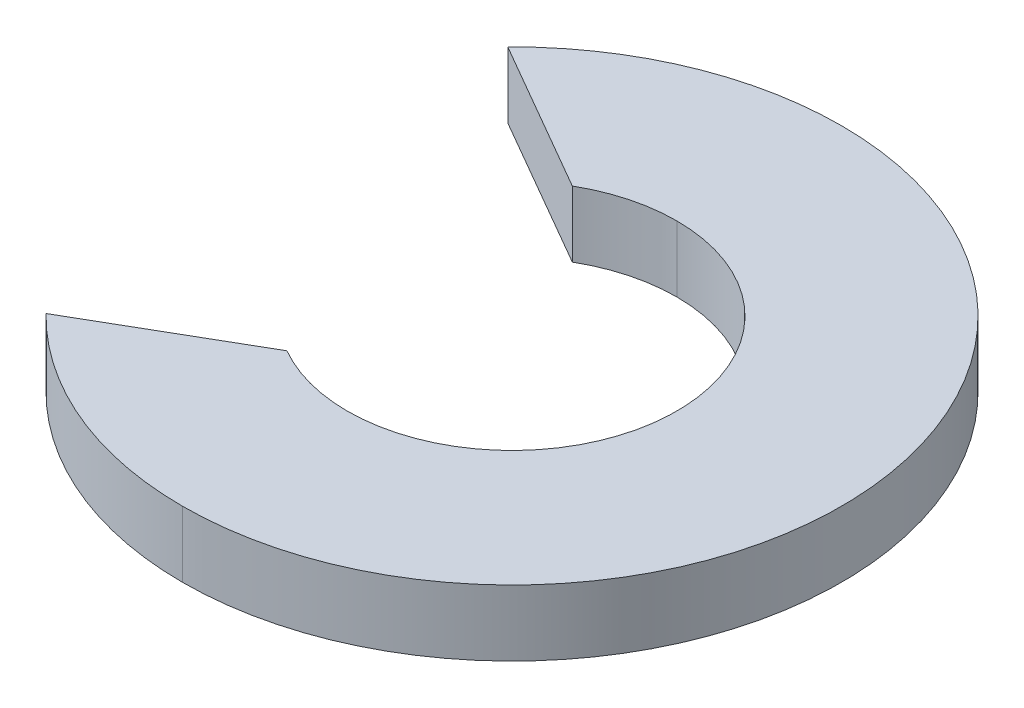
ISO-10303-21;
HEADER;
FILE_DESCRIPTION(('STEP AP214'),'2;1');
FILE_NAME('part.step','',(''),(''),'','','');
FILE_SCHEMA(('AUTOMOTIVE_DESIGN { 1 0 10303 214 1 1 1 1 }'));
ENDSEC;
DATA;
#1=APPLICATION_CONTEXT('core data for automotive mechanical design processes');
#2=APPLICATION_PROTOCOL_DEFINITION('international standard','automotive_design',2000,#1);
#3=PRODUCT_CONTEXT('',#1,'mechanical');
#4=PRODUCT('Part','Part','',(#3));
#5=PRODUCT_RELATED_PRODUCT_CATEGORY('part','',(#4));
#6=PRODUCT_DEFINITION_FORMATION('','',#4);
#7=PRODUCT_DEFINITION_CONTEXT('part definition',#1,'design');
#8=PRODUCT_DEFINITION('design','',#6,#7);
#9=PRODUCT_DEFINITION_SHAPE('','',#8);
#10=(LENGTH_UNIT() NAMED_UNIT(*) SI_UNIT(.MILLI.,.METRE.));
#11=(NAMED_UNIT(*) PLANE_ANGLE_UNIT() SI_UNIT($,.RADIAN.));
#12=(NAMED_UNIT(*) SI_UNIT($,.STERADIAN.) SOLID_ANGLE_UNIT());
#13=UNCERTAINTY_MEASURE_WITH_UNIT(LENGTH_MEASURE(1.E-05),#10,'distance_accuracy_value','');
#14=(GEOMETRIC_REPRESENTATION_CONTEXT(3) GLOBAL_UNCERTAINTY_ASSIGNED_CONTEXT((#13)) GLOBAL_UNIT_ASSIGNED_CONTEXT((#10,
#11,#12)) REPRESENTATION_CONTEXT('',''));
#15=CARTESIAN_POINT('',(0.,0.,0.));
#16=DIRECTION('',(0.,0.,1.));
#17=DIRECTION('',(1.,0.,0.));
#18=AXIS2_PLACEMENT_3D('',#15,#16,#17);
#19=CARTESIAN_POINT('',(0.,0.,0.));
#20=DIRECTION('',(0.,1.,0.));
#21=DIRECTION('',(1.,0.,0.));
#22=AXIS2_PLACEMENT_3D('',#19,#20,#21);
#23=PLANE('',#22);
#24=CARTESIAN_POINT('',(0.,0.,0.));
#25=DIRECTION('',(0.,-1.,0.));
#26=DIRECTION('',(0.,0.,1.));
#27=AXIS2_PLACEMENT_3D('',#24,#25,#26);
#28=CIRCLE('',#27,2.);
#29=CARTESIAN_POINT('',(-1.,0.,-1.73205080756888));
#30=VERTEX_POINT('',#29);
#31=CARTESIAN_POINT('',(0.,0.,-2.));
#32=VERTEX_POINT('',#31);
#33=EDGE_CURVE('E78',#30,#32,#28,.T.);
#34=ORIENTED_EDGE('',*,*,#33,.F.);
#35=DIRECTION('',(0.866025403784442,0.,0.5));
#36=VECTOR('',#35,1.);
#37=CARTESIAN_POINT('',(-1.,0.,-1.73205080756888));
#38=LINE('',#37,#36);
#39=CARTESIAN_POINT('',(-2.8541019662497,0.,-2.80251707688814));
#40=VERTEX_POINT('',#39);
#41=EDGE_CURVE('E21',#40,#30,#38,.T.);
#42=ORIENTED_EDGE('',*,*,#41,.F.);
#43=CARTESIAN_POINT('',(0.,0.,0.));
#44=DIRECTION('',(0.,1.,0.));
#45=DIRECTION('',(0.,0.,1.));
#46=AXIS2_PLACEMENT_3D('',#43,#44,#45);
#47=CIRCLE('',#46,4.);
#48=CARTESIAN_POINT('',(0.,0.,-4.));
#49=VERTEX_POINT('',#48);
#50=EDGE_CURVE('E113',#49,#40,#47,.T.);
#51=ORIENTED_EDGE('',*,*,#50,.F.);
#52=CARTESIAN_POINT('',(0.,0.,0.));
#53=DIRECTION('',(0.,1.,0.));
#54=DIRECTION('',(0.,0.,1.));
#55=AXIS2_PLACEMENT_3D('',#52,#53,#54);
#56=CIRCLE('',#55,4.);
#57=CARTESIAN_POINT('',(0.,0.,4.));
#58=VERTEX_POINT('',#57);
#59=EDGE_CURVE('E116',#58,#49,#56,.T.);
#60=ORIENTED_EDGE('',*,*,#59,.F.);
#61=CARTESIAN_POINT('',(0.,0.,0.));
#62=DIRECTION('',(0.,1.,0.));
#63=DIRECTION('',(0.,0.,1.));
#64=AXIS2_PLACEMENT_3D('',#61,#62,#63);
#65=CIRCLE('',#64,4.);
#66=CARTESIAN_POINT('',(-2.8541019662497,0.,2.80251707688814));
#67=VERTEX_POINT('',#66);
#68=EDGE_CURVE('E155',#67,#58,#65,.T.);
#69=ORIENTED_EDGE('',*,*,#68,.F.);
#70=DIRECTION('',(-0.866025403784442,0.,0.5));
#71=VECTOR('',#70,1.);
#72=CARTESIAN_POINT('',(-1.,0.,1.73205080756888));
#73=LINE('',#72,#71);
#74=CARTESIAN_POINT('',(-1.,0.,1.73205080756888));
#75=VERTEX_POINT('',#74);
#76=EDGE_CURVE('E161',#75,#67,#73,.T.);
#77=ORIENTED_EDGE('',*,*,#76,.F.);
#78=CARTESIAN_POINT('',(0.,0.,0.));
#79=DIRECTION('',(0.,-1.,0.));
#80=DIRECTION('',(0.,0.,1.));
#81=AXIS2_PLACEMENT_3D('',#78,#79,#80);
#82=CIRCLE('',#81,2.);
#83=CARTESIAN_POINT('',(0.,0.,2.));
#84=VERTEX_POINT('',#83);
#85=EDGE_CURVE('E152',#84,#75,#82,.T.);
#86=ORIENTED_EDGE('',*,*,#85,.F.);
#87=CARTESIAN_POINT('',(0.,0.,0.));
#88=DIRECTION('',(0.,-1.,0.));
#89=DIRECTION('',(0.,0.,1.));
#90=AXIS2_PLACEMENT_3D('',#87,#88,#89);
#91=CIRCLE('',#90,2.);
#92=EDGE_CURVE('E167',#32,#84,#91,.T.);
#93=ORIENTED_EDGE('',*,*,#92,.F.);
#94=EDGE_LOOP('',(#34,#42,#51,#60,#69,#77,#86,#93));
#95=FACE_BOUND('',#94,.T.);
#96=ADVANCED_FACE('F17',(#95),#23,.F.);
#97=CARTESIAN_POINT('',(0.,0.8,0.));
#98=DIRECTION('',(0.,1.,0.));
#99=DIRECTION('',(1.,0.,0.));
#100=AXIS2_PLACEMENT_3D('',#97,#98,#99);
#101=PLANE('',#100);
#102=CARTESIAN_POINT('',(0.,0.8,0.));
#103=DIRECTION('',(0.,-1.,0.));
#104=DIRECTION('',(0.,0.,1.));
#105=AXIS2_PLACEMENT_3D('',#102,#103,#104);
#106=CIRCLE('',#105,2.);
#107=CARTESIAN_POINT('',(-1.,0.8,-1.73205080756888));
#108=VERTEX_POINT('',#107);
#109=CARTESIAN_POINT('',(0.,0.8,-2.));
#110=VERTEX_POINT('',#109);
#111=EDGE_CURVE('E170',#108,#110,#106,.T.);
#112=ORIENTED_EDGE('',*,*,#111,.T.);
#113=CARTESIAN_POINT('',(0.,0.8,0.));
#114=DIRECTION('',(0.,-1.,0.));
#115=DIRECTION('',(0.,0.,1.));
#116=AXIS2_PLACEMENT_3D('',#113,#114,#115);
#117=CIRCLE('',#116,2.);
#118=CARTESIAN_POINT('',(0.,0.8,2.));
#119=VERTEX_POINT('',#118);
#120=EDGE_CURVE('E151',#110,#119,#117,.T.);
#121=ORIENTED_EDGE('',*,*,#120,.T.);
#122=CARTESIAN_POINT('',(0.,0.8,0.));
#123=DIRECTION('',(0.,-1.,0.));
#124=DIRECTION('',(0.,0.,1.));
#125=AXIS2_PLACEMENT_3D('',#122,#123,#124);
#126=CIRCLE('',#125,2.);
#127=CARTESIAN_POINT('',(-1.,0.8,1.73205080756888));
#128=VERTEX_POINT('',#127);
#129=EDGE_CURVE('E157',#119,#128,#126,.T.);
#130=ORIENTED_EDGE('',*,*,#129,.T.);
#131=DIRECTION('',(-0.866025403784442,0.,0.5));
#132=VECTOR('',#131,1.);
#133=CARTESIAN_POINT('',(-1.,0.8,1.73205080756888));
#134=LINE('',#133,#132);
#135=CARTESIAN_POINT('',(-2.8541019662497,0.8,2.80251707688814));
#136=VERTEX_POINT('',#135);
#137=EDGE_CURVE('E145',#128,#136,#134,.T.);
#138=ORIENTED_EDGE('',*,*,#137,.T.);
#139=CARTESIAN_POINT('',(0.,0.8,0.));
#140=DIRECTION('',(0.,1.,0.));
#141=DIRECTION('',(0.,0.,1.));
#142=AXIS2_PLACEMENT_3D('',#139,#140,#141);
#143=CIRCLE('',#142,4.);
#144=CARTESIAN_POINT('',(0.,0.8,4.));
#145=VERTEX_POINT('',#144);
#146=EDGE_CURVE('E41',#136,#145,#143,.T.);
#147=ORIENTED_EDGE('',*,*,#146,.T.);
#148=CARTESIAN_POINT('',(0.,0.8,0.));
#149=DIRECTION('',(0.,1.,0.));
#150=DIRECTION('',(0.,0.,1.));
#151=AXIS2_PLACEMENT_3D('',#148,#149,#150);
#152=CIRCLE('',#151,4.);
#153=CARTESIAN_POINT('',(0.,0.8,-4.));
#154=VERTEX_POINT('',#153);
#155=EDGE_CURVE('E141',#145,#154,#152,.T.);
#156=ORIENTED_EDGE('',*,*,#155,.T.);
#157=CARTESIAN_POINT('',(0.,0.8,0.));
#158=DIRECTION('',(0.,1.,0.));
#159=DIRECTION('',(0.,0.,1.));
#160=AXIS2_PLACEMENT_3D('',#157,#158,#159);
#161=CIRCLE('',#160,4.);
#162=CARTESIAN_POINT('',(-2.8541019662497,0.8,-2.80251707688814));
#163=VERTEX_POINT('',#162);
#164=EDGE_CURVE('E123',#154,#163,#161,.T.);
#165=ORIENTED_EDGE('',*,*,#164,.T.);
#166=DIRECTION('',(0.866025403784442,0.,0.5));
#167=VECTOR('',#166,1.);
#168=CARTESIAN_POINT('',(-1.,0.8,-1.73205080756888));
#169=LINE('',#168,#167);
#170=EDGE_CURVE('E11',#163,#108,#169,.T.);
#171=ORIENTED_EDGE('',*,*,#170,.T.);
#172=EDGE_LOOP('',(#112,#121,#130,#138,#147,#156,#165,#171));
#173=FACE_BOUND('',#172,.T.);
#174=ADVANCED_FACE('F19',(#173),#101,.T.);
#175=CARTESIAN_POINT('',(-1.,0.8,-1.73205080756888));
#176=DIRECTION('',(0.5,0.,-0.866025403784442));
#177=DIRECTION('',(0.,-1.,0.));
#178=AXIS2_PLACEMENT_3D('',#175,#176,#177);
#179=PLANE('',#178);
#180=ORIENTED_EDGE('',*,*,#41,.T.);
#181=DIRECTION('',(0.,-1.,0.));
#182=VECTOR('',#181,1.);
#183=CARTESIAN_POINT('',(-1.,0.8,-1.73205080756888));
#184=LINE('',#183,#182);
#185=EDGE_CURVE('E162',#108,#30,#184,.T.);
#186=ORIENTED_EDGE('',*,*,#185,.F.);
#187=ORIENTED_EDGE('',*,*,#170,.F.);
#188=DIRECTION('',(0.,-1.,0.));
#189=VECTOR('',#188,1.);
#190=CARTESIAN_POINT('',(-2.8541019662497,0.8,-2.80251707688814));
#191=LINE('',#190,#189);
#192=EDGE_CURVE('E122',#163,#40,#191,.T.);
#193=ORIENTED_EDGE('',*,*,#192,.T.);
#194=EDGE_LOOP('',(#180,#186,#187,#193));
#195=FACE_BOUND('',#194,.T.);
#196=ADVANCED_FACE('F198',(#195),#179,.F.);
#197=CARTESIAN_POINT('',(0.,0.8,0.));
#198=DIRECTION('',(0.,-1.,0.));
#199=DIRECTION('',(0.,0.,-1.));
#200=AXIS2_PLACEMENT_3D('',#197,#198,#199);
#201=CYLINDRICAL_SURFACE('',#200,4.);
#202=DIRECTION('',(0.,-1.,0.));
#203=VECTOR('',#202,1.);
#204=CARTESIAN_POINT('',(0.,0.8,4.));
#205=LINE('',#204,#203);
#206=EDGE_CURVE('E134',#145,#58,#205,.T.);
#207=ORIENTED_EDGE('',*,*,#206,.F.);
#208=ORIENTED_EDGE('',*,*,#146,.F.);
#209=DIRECTION('',(0.,-1.,0.));
#210=VECTOR('',#209,1.);
#211=CARTESIAN_POINT('',(-2.8541019662497,0.8,2.80251707688814));
#212=LINE('',#211,#210);
#213=EDGE_CURVE('E174',#136,#67,#212,.T.);
#214=ORIENTED_EDGE('',*,*,#213,.T.);
#215=ORIENTED_EDGE('',*,*,#68,.T.);
#216=EDGE_LOOP('',(#207,#208,#214,#215));
#217=FACE_BOUND('',#216,.T.);
#218=ADVANCED_FACE('F336',(#217),#201,.T.);
#219=CARTESIAN_POINT('',(-1.,0.8,1.73205080756888));
#220=DIRECTION('',(0.5,0.,0.866025403784442));
#221=DIRECTION('',(0.,-1.,0.));
#222=AXIS2_PLACEMENT_3D('',#219,#220,#221);
#223=PLANE('',#222);
#224=ORIENTED_EDGE('',*,*,#76,.T.);
#225=ORIENTED_EDGE('',*,*,#213,.F.);
#226=ORIENTED_EDGE('',*,*,#137,.F.);
#227=DIRECTION('',(0.,-1.,0.));
#228=VECTOR('',#227,1.);
#229=CARTESIAN_POINT('',(-1.,0.8,1.73205080756888));
#230=LINE('',#229,#228);
#231=EDGE_CURVE('E147',#128,#75,#230,.T.);
#232=ORIENTED_EDGE('',*,*,#231,.T.);
#233=EDGE_LOOP('',(#224,#225,#226,#232));
#234=FACE_BOUND('',#233,.T.);
#235=ADVANCED_FACE('F219',(#234),#223,.F.);
#236=CARTESIAN_POINT('',(0.,0.8,0.));
#237=DIRECTION('',(0.,-1.,0.));
#238=DIRECTION('',(0.,0.,-1.));
#239=AXIS2_PLACEMENT_3D('',#236,#237,#238);
#240=CYLINDRICAL_SURFACE('',#239,2.);
#241=DIRECTION('',(0.,-1.,0.));
#242=VECTOR('',#241,1.);
#243=CARTESIAN_POINT('',(0.,0.8,-2.));
#244=LINE('',#243,#242);
#245=EDGE_CURVE('E171',#110,#32,#244,.T.);
#246=ORIENTED_EDGE('',*,*,#245,.F.);
#247=ORIENTED_EDGE('',*,*,#111,.F.);
#248=ORIENTED_EDGE('',*,*,#185,.T.);
#249=ORIENTED_EDGE('',*,*,#33,.T.);
#250=EDGE_LOOP('',(#246,#247,#248,#249));
#251=FACE_BOUND('',#250,.T.);
#252=ADVANCED_FACE('F196',(#251),#240,.F.);
#253=CARTESIAN_POINT('',(0.,0.8,0.));
#254=DIRECTION('',(0.,-1.,0.));
#255=DIRECTION('',(0.,0.,-1.));
#256=AXIS2_PLACEMENT_3D('',#253,#254,#255);
#257=CYLINDRICAL_SURFACE('',#256,2.);
#258=DIRECTION('',(0.,-1.,0.));
#259=VECTOR('',#258,1.);
#260=CARTESIAN_POINT('',(0.,0.8,2.));
#261=LINE('',#260,#259);
#262=EDGE_CURVE('E166',#119,#84,#261,.T.);
#263=ORIENTED_EDGE('',*,*,#262,.F.);
#264=ORIENTED_EDGE('',*,*,#120,.F.);
#265=ORIENTED_EDGE('',*,*,#245,.T.);
#266=ORIENTED_EDGE('',*,*,#92,.T.);
#267=EDGE_LOOP('',(#263,#264,#265,#266));
#268=FACE_BOUND('',#267,.T.);
#269=ADVANCED_FACE('F205',(#268),#257,.F.);
#270=CARTESIAN_POINT('',(0.,0.8,0.));
#271=DIRECTION('',(0.,-1.,0.));
#272=DIRECTION('',(0.,0.,-1.));
#273=AXIS2_PLACEMENT_3D('',#270,#271,#272);
#274=CYLINDRICAL_SURFACE('',#273,2.);
#275=ORIENTED_EDGE('',*,*,#129,.F.);
#276=ORIENTED_EDGE('',*,*,#262,.T.);
#277=ORIENTED_EDGE('',*,*,#85,.T.);
#278=ORIENTED_EDGE('',*,*,#231,.F.);
#279=EDGE_LOOP('',(#275,#276,#277,#278));
#280=FACE_BOUND('',#279,.T.);
#281=ADVANCED_FACE('F216',(#280),#274,.F.);
#282=CARTESIAN_POINT('',(0.,0.8,0.));
#283=DIRECTION('',(0.,-1.,0.));
#284=DIRECTION('',(0.,0.,-1.));
#285=AXIS2_PLACEMENT_3D('',#282,#283,#284);
#286=CYLINDRICAL_SURFACE('',#285,4.);
#287=ORIENTED_EDGE('',*,*,#164,.F.);
#288=DIRECTION('',(0.,-1.,0.));
#289=VECTOR('',#288,1.);
#290=CARTESIAN_POINT('',(0.,0.8,-4.));
#291=LINE('',#290,#289);
#292=EDGE_CURVE('E126',#154,#49,#291,.T.);
#293=ORIENTED_EDGE('',*,*,#292,.T.);
#294=ORIENTED_EDGE('',*,*,#50,.T.);
#295=ORIENTED_EDGE('',*,*,#192,.F.);
#296=EDGE_LOOP('',(#287,#293,#294,#295));
#297=FACE_BOUND('',#296,.T.);
#298=ADVANCED_FACE('F127',(#297),#286,.T.);
#299=CARTESIAN_POINT('',(0.,0.8,0.));
#300=DIRECTION('',(0.,-1.,0.));
#301=DIRECTION('',(0.,0.,-1.));
#302=AXIS2_PLACEMENT_3D('',#299,#300,#301);
#303=CYLINDRICAL_SURFACE('',#302,4.);
#304=ORIENTED_EDGE('',*,*,#155,.F.);
#305=ORIENTED_EDGE('',*,*,#206,.T.);
#306=ORIENTED_EDGE('',*,*,#59,.T.);
#307=ORIENTED_EDGE('',*,*,#292,.F.);
#308=EDGE_LOOP('',(#304,#305,#306,#307));
#309=FACE_BOUND('',#308,.T.);
#310=ADVANCED_FACE('F133',(#309),#303,.T.);
#311=CLOSED_SHELL('',(#96,#174,#196,#218,#235,#252,#269,#281,#298,#310));
#312=MANIFOLD_SOLID_BREP('B1',#311);
#313=ADVANCED_BREP_SHAPE_REPRESENTATION('',(#18,#312),#14);
#314=SHAPE_DEFINITION_REPRESENTATION(#9,#313);
ENDSEC;
END-ISO-10303-21;
